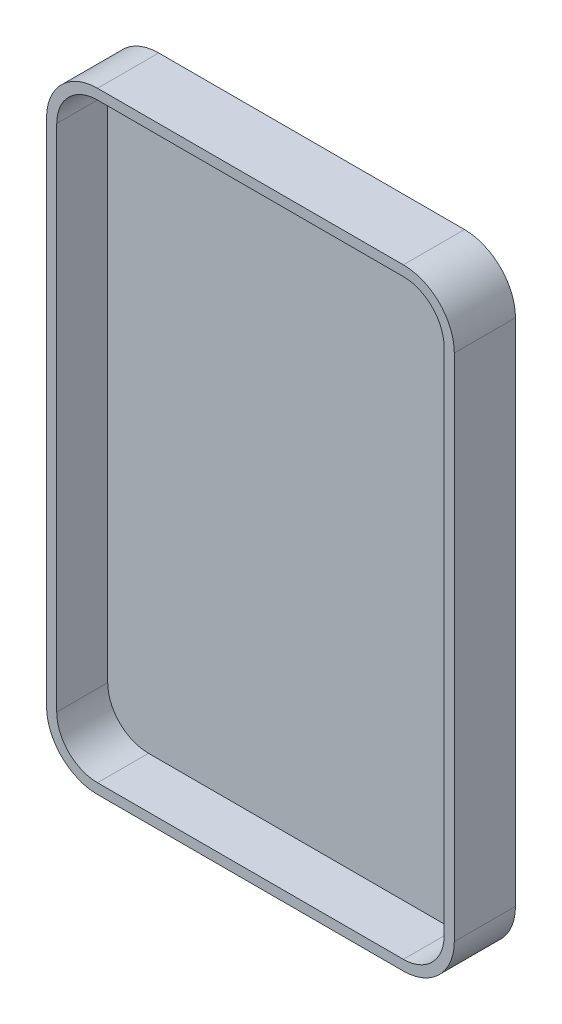
ISO-10303-21;
HEADER;
FILE_DESCRIPTION(('STEP AP214'),'2;1');
FILE_NAME('part.step','',(''),(''),'','','');
FILE_SCHEMA(('AUTOMOTIVE_DESIGN { 1 0 10303 214 1 1 1 1 }'));
ENDSEC;
DATA;
#1=APPLICATION_CONTEXT('core data for automotive mechanical design processes');
#2=APPLICATION_PROTOCOL_DEFINITION('international standard','automotive_design',2000,#1);
#3=PRODUCT_CONTEXT('',#1,'mechanical');
#4=PRODUCT('Part','Part','',(#3));
#5=PRODUCT_RELATED_PRODUCT_CATEGORY('part','',(#4));
#6=PRODUCT_DEFINITION_FORMATION('','',#4);
#7=PRODUCT_DEFINITION_CONTEXT('part definition',#1,'design');
#8=PRODUCT_DEFINITION('design','',#6,#7);
#9=PRODUCT_DEFINITION_SHAPE('','',#8);
#10=(LENGTH_UNIT() NAMED_UNIT(*) SI_UNIT(.MILLI.,.METRE.));
#11=(NAMED_UNIT(*) PLANE_ANGLE_UNIT() SI_UNIT($,.RADIAN.));
#12=(NAMED_UNIT(*) SI_UNIT($,.STERADIAN.) SOLID_ANGLE_UNIT());
#13=UNCERTAINTY_MEASURE_WITH_UNIT(LENGTH_MEASURE(1.E-05),#10,'distance_accuracy_value','');
#14=(GEOMETRIC_REPRESENTATION_CONTEXT(3) GLOBAL_UNCERTAINTY_ASSIGNED_CONTEXT((#13)) GLOBAL_UNIT_ASSIGNED_CONTEXT((#10,
#11,#12)) REPRESENTATION_CONTEXT('',''));
#15=CARTESIAN_POINT('',(0.,0.,0.));
#16=DIRECTION('',(0.,0.,1.));
#17=DIRECTION('',(1.,0.,0.));
#18=AXIS2_PLACEMENT_3D('',#15,#16,#17);
#19=CARTESIAN_POINT('',(0.,0.,2.));
#20=DIRECTION('',(0.,-1.,0.));
#21=DIRECTION('',(1.,0.,0.));
#22=AXIS2_PLACEMENT_3D('',#19,#20,#21);
#23=PLANE('',#22);
#24=DIRECTION('',(-1.,0.,0.));
#25=VECTOR('',#24,1.);
#26=CARTESIAN_POINT('',(0.,0.,0.));
#27=LINE('',#26,#25);
#28=CARTESIAN_POINT('',(-10.,0.,0.));
#29=VERTEX_POINT('',#28);
#30=CARTESIAN_POINT('',(-70.,0.,0.));
#31=VERTEX_POINT('',#30);
#32=EDGE_CURVE('E247',#29,#31,#27,.T.);
#33=ORIENTED_EDGE('',*,*,#32,.F.);
#34=DIRECTION('',(0.,0.,-1.));
#35=VECTOR('',#34,1.);
#36=CARTESIAN_POINT('',(-10.,0.,2.));
#37=LINE('',#36,#35);
#38=CARTESIAN_POINT('',(-10.,0.,12.));
#39=VERTEX_POINT('',#38);
#40=EDGE_CURVE('E11',#39,#29,#37,.T.);
#41=ORIENTED_EDGE('',*,*,#40,.F.);
#42=DIRECTION('',(1.,0.,0.));
#43=VECTOR('',#42,1.);
#44=CARTESIAN_POINT('',(0.,0.,12.));
#45=LINE('',#44,#43);
#46=CARTESIAN_POINT('',(-70.,0.,12.));
#47=VERTEX_POINT('',#46);
#48=EDGE_CURVE('E187',#47,#39,#45,.T.);
#49=ORIENTED_EDGE('',*,*,#48,.F.);
#50=DIRECTION('',(0.,0.,-1.));
#51=VECTOR('',#50,1.);
#52=CARTESIAN_POINT('',(-70.,0.,2.));
#53=LINE('',#52,#51);
#54=EDGE_CURVE('E266',#47,#31,#53,.T.);
#55=ORIENTED_EDGE('',*,*,#54,.T.);
#56=EDGE_LOOP('',(#33,#41,#49,#55));
#57=FACE_BOUND('',#56,.T.);
#58=ADVANCED_FACE('F35',(#57),#23,.T.);
#59=CARTESIAN_POINT('',(-10.,10.,2.));
#60=DIRECTION('',(0.,0.,-1.));
#61=DIRECTION('',(-1.,0.,0.));
#62=AXIS2_PLACEMENT_3D('',#59,#60,#61);
#63=CYLINDRICAL_SURFACE('',#62,10.);
#64=CARTESIAN_POINT('',(-10.,10.,0.));
#65=DIRECTION('',(0.,0.,1.));
#66=DIRECTION('',(1.,0.,0.));
#67=AXIS2_PLACEMENT_3D('',#64,#65,#66);
#68=CIRCLE('',#67,10.);
#69=CARTESIAN_POINT('',(0.,10.,0.));
#70=VERTEX_POINT('',#69);
#71=EDGE_CURVE('E250',#29,#70,#68,.T.);
#72=ORIENTED_EDGE('',*,*,#71,.T.);
#73=DIRECTION('',(0.,0.,-1.));
#74=VECTOR('',#73,1.);
#75=CARTESIAN_POINT('',(0.,10.,2.));
#76=LINE('',#75,#74);
#77=CARTESIAN_POINT('',(0.,10.,12.));
#78=VERTEX_POINT('',#77);
#79=EDGE_CURVE('E42',#78,#70,#76,.T.);
#80=ORIENTED_EDGE('',*,*,#79,.F.);
#81=CARTESIAN_POINT('',(-10.,10.,12.));
#82=DIRECTION('',(0.,0.,1.));
#83=DIRECTION('',(1.,0.,0.));
#84=AXIS2_PLACEMENT_3D('',#81,#82,#83);
#85=CIRCLE('',#84,10.);
#86=EDGE_CURVE('E171',#39,#78,#85,.T.);
#87=ORIENTED_EDGE('',*,*,#86,.F.);
#88=ORIENTED_EDGE('',*,*,#40,.T.);
#89=EDGE_LOOP('',(#72,#80,#87,#88));
#90=FACE_BOUND('',#89,.T.);
#91=ADVANCED_FACE('F297',(#90),#63,.T.);
#92=CARTESIAN_POINT('',(0.,0.,2.));
#93=DIRECTION('',(-1.,0.,0.));
#94=DIRECTION('',(0.,0.,1.));
#95=AXIS2_PLACEMENT_3D('',#92,#93,#94);
#96=PLANE('',#95);
#97=DIRECTION('',(0.,1.,0.));
#98=VECTOR('',#97,1.);
#99=CARTESIAN_POINT('',(0.,0.,0.));
#100=LINE('',#99,#98);
#101=CARTESIAN_POINT('',(0.,110.,0.));
#102=VERTEX_POINT('',#101);
#103=EDGE_CURVE('E152',#70,#102,#100,.T.);
#104=ORIENTED_EDGE('',*,*,#103,.T.);
#105=DIRECTION('',(0.,0.,-1.));
#106=VECTOR('',#105,1.);
#107=CARTESIAN_POINT('',(0.,110.,2.));
#108=LINE('',#107,#106);
#109=CARTESIAN_POINT('',(0.,110.,12.));
#110=VERTEX_POINT('',#109);
#111=EDGE_CURVE('E145',#110,#102,#108,.T.);
#112=ORIENTED_EDGE('',*,*,#111,.F.);
#113=DIRECTION('',(0.,1.,0.));
#114=VECTOR('',#113,1.);
#115=CARTESIAN_POINT('',(0.,0.,12.));
#116=LINE('',#115,#114);
#117=EDGE_CURVE('E150',#78,#110,#116,.T.);
#118=ORIENTED_EDGE('',*,*,#117,.F.);
#119=ORIENTED_EDGE('',*,*,#79,.T.);
#120=EDGE_LOOP('',(#104,#112,#118,#119));
#121=FACE_BOUND('',#120,.T.);
#122=ADVANCED_FACE('F147',(#121),#96,.F.);
#123=CARTESIAN_POINT('',(-10.,110.,2.));
#124=DIRECTION('',(0.,0.,-1.));
#125=DIRECTION('',(-1.,0.,0.));
#126=AXIS2_PLACEMENT_3D('',#123,#124,#125);
#127=CYLINDRICAL_SURFACE('',#126,10.);
#128=CARTESIAN_POINT('',(-10.,110.,0.));
#129=DIRECTION('',(0.,0.,1.));
#130=DIRECTION('',(1.,0.,0.));
#131=AXIS2_PLACEMENT_3D('',#128,#129,#130);
#132=CIRCLE('',#131,10.);
#133=CARTESIAN_POINT('',(-10.,120.,0.));
#134=VERTEX_POINT('',#133);
#135=EDGE_CURVE('E253',#102,#134,#132,.T.);
#136=ORIENTED_EDGE('',*,*,#135,.T.);
#137=DIRECTION('',(0.,0.,-1.));
#138=VECTOR('',#137,1.);
#139=CARTESIAN_POINT('',(-10.,120.,2.));
#140=LINE('',#139,#138);
#141=CARTESIAN_POINT('',(-10.,120.,12.));
#142=VERTEX_POINT('',#141);
#143=EDGE_CURVE('E155',#142,#134,#140,.T.);
#144=ORIENTED_EDGE('',*,*,#143,.F.);
#145=CARTESIAN_POINT('',(-10.,110.,12.));
#146=DIRECTION('',(0.,0.,1.));
#147=DIRECTION('',(1.,0.,0.));
#148=AXIS2_PLACEMENT_3D('',#145,#146,#147);
#149=CIRCLE('',#148,10.);
#150=EDGE_CURVE('E158',#110,#142,#149,.T.);
#151=ORIENTED_EDGE('',*,*,#150,.F.);
#152=ORIENTED_EDGE('',*,*,#111,.T.);
#153=EDGE_LOOP('',(#136,#144,#151,#152));
#154=FACE_BOUND('',#153,.T.);
#155=ADVANCED_FACE('F159',(#154),#127,.T.);
#156=CARTESIAN_POINT('',(0.,120.,2.));
#157=DIRECTION('',(0.,-1.,0.));
#158=DIRECTION('',(1.,0.,0.));
#159=AXIS2_PLACEMENT_3D('',#156,#157,#158);
#160=PLANE('',#159);
#161=DIRECTION('',(-1.,0.,0.));
#162=VECTOR('',#161,1.);
#163=CARTESIAN_POINT('',(0.,120.,0.));
#164=LINE('',#163,#162);
#165=CARTESIAN_POINT('',(-70.,120.,0.));
#166=VERTEX_POINT('',#165);
#167=EDGE_CURVE('E255',#134,#166,#164,.T.);
#168=ORIENTED_EDGE('',*,*,#167,.T.);
#169=DIRECTION('',(0.,0.,-1.));
#170=VECTOR('',#169,1.);
#171=CARTESIAN_POINT('',(-70.,120.,2.));
#172=LINE('',#171,#170);
#173=CARTESIAN_POINT('',(-70.,120.,12.));
#174=VERTEX_POINT('',#173);
#175=EDGE_CURVE('E272',#174,#166,#172,.T.);
#176=ORIENTED_EDGE('',*,*,#175,.F.);
#177=DIRECTION('',(-1.,0.,0.));
#178=VECTOR('',#177,1.);
#179=CARTESIAN_POINT('',(0.,120.,12.));
#180=LINE('',#179,#178);
#181=EDGE_CURVE('E164',#142,#174,#180,.T.);
#182=ORIENTED_EDGE('',*,*,#181,.F.);
#183=ORIENTED_EDGE('',*,*,#143,.T.);
#184=EDGE_LOOP('',(#168,#176,#182,#183));
#185=FACE_BOUND('',#184,.T.);
#186=ADVANCED_FACE('F283',(#185),#160,.F.);
#187=CARTESIAN_POINT('',(-70.,110.,2.));
#188=DIRECTION('',(0.,0.,-1.));
#189=DIRECTION('',(-1.,0.,0.));
#190=AXIS2_PLACEMENT_3D('',#187,#188,#189);
#191=CYLINDRICAL_SURFACE('',#190,10.);
#192=CARTESIAN_POINT('',(-70.,110.,0.));
#193=DIRECTION('',(0.,0.,1.));
#194=DIRECTION('',(1.,0.,0.));
#195=AXIS2_PLACEMENT_3D('',#192,#193,#194);
#196=CIRCLE('',#195,10.);
#197=CARTESIAN_POINT('',(-80.,110.,0.));
#198=VERTEX_POINT('',#197);
#199=EDGE_CURVE('E257',#166,#198,#196,.T.);
#200=ORIENTED_EDGE('',*,*,#199,.T.);
#201=DIRECTION('',(0.,0.,-1.));
#202=VECTOR('',#201,1.);
#203=CARTESIAN_POINT('',(-80.,110.,2.));
#204=LINE('',#203,#202);
#205=CARTESIAN_POINT('',(-80.,110.,12.));
#206=VERTEX_POINT('',#205);
#207=EDGE_CURVE('E270',#206,#198,#204,.T.);
#208=ORIENTED_EDGE('',*,*,#207,.F.);
#209=CARTESIAN_POINT('',(-70.,110.,12.));
#210=DIRECTION('',(0.,0.,1.));
#211=DIRECTION('',(1.,0.,0.));
#212=AXIS2_PLACEMENT_3D('',#209,#210,#211);
#213=CIRCLE('',#212,10.);
#214=EDGE_CURVE('E178',#174,#206,#213,.T.);
#215=ORIENTED_EDGE('',*,*,#214,.F.);
#216=ORIENTED_EDGE('',*,*,#175,.T.);
#217=EDGE_LOOP('',(#200,#208,#215,#216));
#218=FACE_BOUND('',#217,.T.);
#219=ADVANCED_FACE('F287',(#218),#191,.T.);
#220=CARTESIAN_POINT('',(-80.,0.,2.));
#221=DIRECTION('',(-1.,0.,0.));
#222=DIRECTION('',(0.,0.,1.));
#223=AXIS2_PLACEMENT_3D('',#220,#221,#222);
#224=PLANE('',#223);
#225=DIRECTION('',(0.,1.,0.));
#226=VECTOR('',#225,1.);
#227=CARTESIAN_POINT('',(-80.,0.,0.));
#228=LINE('',#227,#226);
#229=CARTESIAN_POINT('',(-80.,9.99999999999999,0.));
#230=VERTEX_POINT('',#229);
#231=EDGE_CURVE('E260',#230,#198,#228,.T.);
#232=ORIENTED_EDGE('',*,*,#231,.F.);
#233=DIRECTION('',(0.,0.,-1.));
#234=VECTOR('',#233,1.);
#235=CARTESIAN_POINT('',(-80.,9.99999999999999,2.));
#236=LINE('',#235,#234);
#237=CARTESIAN_POINT('',(-80.,9.99999999999999,12.));
#238=VERTEX_POINT('',#237);
#239=EDGE_CURVE('E268',#238,#230,#236,.T.);
#240=ORIENTED_EDGE('',*,*,#239,.F.);
#241=DIRECTION('',(0.,-1.,0.));
#242=VECTOR('',#241,1.);
#243=CARTESIAN_POINT('',(-80.,0.,12.));
#244=LINE('',#243,#242);
#245=EDGE_CURVE('E181',#206,#238,#244,.T.);
#246=ORIENTED_EDGE('',*,*,#245,.F.);
#247=ORIENTED_EDGE('',*,*,#207,.T.);
#248=EDGE_LOOP('',(#232,#240,#246,#247));
#249=FACE_BOUND('',#248,.T.);
#250=ADVANCED_FACE('F290',(#249),#224,.T.);
#251=CARTESIAN_POINT('',(-70.,9.99999999999999,2.));
#252=DIRECTION('',(0.,0.,-1.));
#253=DIRECTION('',(-1.,0.,0.));
#254=AXIS2_PLACEMENT_3D('',#251,#252,#253);
#255=CYLINDRICAL_SURFACE('',#254,10.);
#256=CARTESIAN_POINT('',(-70.,9.99999999999999,0.));
#257=DIRECTION('',(0.,0.,1.));
#258=DIRECTION('',(1.,0.,0.));
#259=AXIS2_PLACEMENT_3D('',#256,#257,#258);
#260=CIRCLE('',#259,10.);
#261=EDGE_CURVE('E263',#230,#31,#260,.T.);
#262=ORIENTED_EDGE('',*,*,#261,.T.);
#263=ORIENTED_EDGE('',*,*,#54,.F.);
#264=CARTESIAN_POINT('',(-70.,9.99999999999999,12.));
#265=DIRECTION('',(0.,0.,1.));
#266=DIRECTION('',(1.,0.,0.));
#267=AXIS2_PLACEMENT_3D('',#264,#265,#266);
#268=CIRCLE('',#267,10.);
#269=EDGE_CURVE('E184',#238,#47,#268,.T.);
#270=ORIENTED_EDGE('',*,*,#269,.F.);
#271=ORIENTED_EDGE('',*,*,#239,.T.);
#272=EDGE_LOOP('',(#262,#263,#270,#271));
#273=FACE_BOUND('',#272,.T.);
#274=ADVANCED_FACE('F294',(#273),#255,.T.);
#275=CARTESIAN_POINT('',(0.,0.,0.));
#276=DIRECTION('',(0.,0.,1.));
#277=DIRECTION('',(1.,0.,0.));
#278=AXIS2_PLACEMENT_3D('',#275,#276,#277);
#279=PLANE('',#278);
#280=ORIENTED_EDGE('',*,*,#32,.T.);
#281=ORIENTED_EDGE('',*,*,#261,.F.);
#282=ORIENTED_EDGE('',*,*,#231,.T.);
#283=ORIENTED_EDGE('',*,*,#199,.F.);
#284=ORIENTED_EDGE('',*,*,#167,.F.);
#285=ORIENTED_EDGE('',*,*,#135,.F.);
#286=ORIENTED_EDGE('',*,*,#103,.F.);
#287=ORIENTED_EDGE('',*,*,#71,.F.);
#288=EDGE_LOOP('',(#280,#281,#282,#283,#284,#285,#286,#287));
#289=FACE_BOUND('',#288,.T.);
#290=ADVANCED_FACE('F278',(#289),#279,.F.);
#291=CARTESIAN_POINT('',(-78.,0.,12.));
#292=DIRECTION('',(-1.,0.,0.));
#293=DIRECTION('',(0.,0.,1.));
#294=AXIS2_PLACEMENT_3D('',#291,#292,#293);
#295=PLANE('',#294);
#296=DIRECTION('',(0.,1.,0.));
#297=VECTOR('',#296,1.);
#298=CARTESIAN_POINT('',(-78.,0.,2.));
#299=LINE('',#298,#297);
#300=CARTESIAN_POINT('',(-78.,9.99999999999999,2.));
#301=VERTEX_POINT('',#300);
#302=CARTESIAN_POINT('',(-78.,110.,2.));
#303=VERTEX_POINT('',#302);
#304=EDGE_CURVE('E213',#301,#303,#299,.T.);
#305=ORIENTED_EDGE('',*,*,#304,.T.);
#306=DIRECTION('',(0.,0.,-1.));
#307=VECTOR('',#306,1.);
#308=CARTESIAN_POINT('',(-78.,110.,12.));
#309=LINE('',#308,#307);
#310=CARTESIAN_POINT('',(-78.,110.,12.));
#311=VERTEX_POINT('',#310);
#312=EDGE_CURVE('E245',#311,#303,#309,.T.);
#313=ORIENTED_EDGE('',*,*,#312,.F.);
#314=DIRECTION('',(0.,1.,0.));
#315=VECTOR('',#314,1.);
#316=CARTESIAN_POINT('',(-78.,0.,12.));
#317=LINE('',#316,#315);
#318=CARTESIAN_POINT('',(-78.,9.99999999999999,12.));
#319=VERTEX_POINT('',#318);
#320=EDGE_CURVE('E190',#319,#311,#317,.T.);
#321=ORIENTED_EDGE('',*,*,#320,.F.);
#322=DIRECTION('',(0.,0.,-1.));
#323=VECTOR('',#322,1.);
#324=CARTESIAN_POINT('',(-78.,9.99999999999999,12.));
#325=LINE('',#324,#323);
#326=EDGE_CURVE('E212',#319,#301,#325,.T.);
#327=ORIENTED_EDGE('',*,*,#326,.T.);
#328=EDGE_LOOP('',(#305,#313,#321,#327));
#329=FACE_BOUND('',#328,.T.);
#330=ADVANCED_FACE('F317',(#329),#295,.F.);
#331=CARTESIAN_POINT('',(-70.,110.,12.));
#332=DIRECTION('',(0.,0.,-1.));
#333=DIRECTION('',(-1.,0.,0.));
#334=AXIS2_PLACEMENT_3D('',#331,#332,#333);
#335=CYLINDRICAL_SURFACE('',#334,7.99999999999998);
#336=CARTESIAN_POINT('',(-70.,110.,2.));
#337=DIRECTION('',(0.,0.,1.));
#338=DIRECTION('',(1.,0.,0.));
#339=AXIS2_PLACEMENT_3D('',#336,#337,#338);
#340=CIRCLE('',#339,7.99999999999998);
#341=CARTESIAN_POINT('',(-70.,118.,2.));
#342=VERTEX_POINT('',#341);
#343=EDGE_CURVE('E49',#342,#303,#340,.T.);
#344=ORIENTED_EDGE('',*,*,#343,.F.);
#345=DIRECTION('',(0.,0.,-1.));
#346=VECTOR('',#345,1.);
#347=CARTESIAN_POINT('',(-70.,118.,12.));
#348=LINE('',#347,#346);
#349=CARTESIAN_POINT('',(-70.,118.,12.));
#350=VERTEX_POINT('',#349);
#351=EDGE_CURVE('E243',#350,#342,#348,.T.);
#352=ORIENTED_EDGE('',*,*,#351,.F.);
#353=CARTESIAN_POINT('',(-70.,110.,12.));
#354=DIRECTION('',(0.,0.,1.));
#355=DIRECTION('',(1.,0.,0.));
#356=AXIS2_PLACEMENT_3D('',#353,#354,#355);
#357=CIRCLE('',#356,7.99999999999998);
#358=EDGE_CURVE('E192',#350,#311,#357,.T.);
#359=ORIENTED_EDGE('',*,*,#358,.T.);
#360=ORIENTED_EDGE('',*,*,#312,.T.);
#361=EDGE_LOOP('',(#344,#352,#359,#360));
#362=FACE_BOUND('',#361,.T.);
#363=ADVANCED_FACE('F323',(#362),#335,.F.);
#364=CARTESIAN_POINT('',(0.,118.,12.));
#365=DIRECTION('',(0.,-1.,0.));
#366=DIRECTION('',(1.,0.,0.));
#367=AXIS2_PLACEMENT_3D('',#364,#365,#366);
#368=PLANE('',#367);
#369=DIRECTION('',(-1.,0.,0.));
#370=VECTOR('',#369,1.);
#371=CARTESIAN_POINT('',(0.,118.,2.));
#372=LINE('',#371,#370);
#373=CARTESIAN_POINT('',(-10.,118.,2.));
#374=VERTEX_POINT('',#373);
#375=EDGE_CURVE('E54',#374,#342,#372,.T.);
#376=ORIENTED_EDGE('',*,*,#375,.F.);
#377=DIRECTION('',(0.,0.,-1.));
#378=VECTOR('',#377,1.);
#379=CARTESIAN_POINT('',(-10.,118.,12.));
#380=LINE('',#379,#378);
#381=CARTESIAN_POINT('',(-10.,118.,12.));
#382=VERTEX_POINT('',#381);
#383=EDGE_CURVE('E240',#382,#374,#380,.T.);
#384=ORIENTED_EDGE('',*,*,#383,.F.);
#385=DIRECTION('',(-1.,0.,0.));
#386=VECTOR('',#385,1.);
#387=CARTESIAN_POINT('',(0.,118.,12.));
#388=LINE('',#387,#386);
#389=EDGE_CURVE('E195',#382,#350,#388,.T.);
#390=ORIENTED_EDGE('',*,*,#389,.T.);
#391=ORIENTED_EDGE('',*,*,#351,.T.);
#392=EDGE_LOOP('',(#376,#384,#390,#391));
#393=FACE_BOUND('',#392,.T.);
#394=ADVANCED_FACE('F327',(#393),#368,.T.);
#395=CARTESIAN_POINT('',(-9.99999999999999,110.,12.));
#396=DIRECTION('',(0.,0.,-1.));
#397=DIRECTION('',(-1.,0.,0.));
#398=AXIS2_PLACEMENT_3D('',#395,#396,#397);
#399=CYLINDRICAL_SURFACE('',#398,7.99999999999999);
#400=CARTESIAN_POINT('',(-9.99999999999999,110.,2.));
#401=DIRECTION('',(0.,0.,1.));
#402=DIRECTION('',(1.,0.,0.));
#403=AXIS2_PLACEMENT_3D('',#400,#401,#402);
#404=CIRCLE('',#403,7.99999999999999);
#405=CARTESIAN_POINT('',(-2.,110.,2.));
#406=VERTEX_POINT('',#405);
#407=EDGE_CURVE('E218',#406,#374,#404,.T.);
#408=ORIENTED_EDGE('',*,*,#407,.F.);
#409=DIRECTION('',(0.,0.,-1.));
#410=VECTOR('',#409,1.);
#411=CARTESIAN_POINT('',(-2.,110.,12.));
#412=LINE('',#411,#410);
#413=CARTESIAN_POINT('',(-2.,110.,12.));
#414=VERTEX_POINT('',#413);
#415=EDGE_CURVE('E237',#414,#406,#412,.T.);
#416=ORIENTED_EDGE('',*,*,#415,.F.);
#417=CARTESIAN_POINT('',(-9.99999999999999,110.,12.));
#418=DIRECTION('',(0.,0.,1.));
#419=DIRECTION('',(1.,0.,0.));
#420=AXIS2_PLACEMENT_3D('',#417,#418,#419);
#421=CIRCLE('',#420,7.99999999999999);
#422=EDGE_CURVE('E198',#414,#382,#421,.T.);
#423=ORIENTED_EDGE('',*,*,#422,.T.);
#424=ORIENTED_EDGE('',*,*,#383,.T.);
#425=EDGE_LOOP('',(#408,#416,#423,#424));
#426=FACE_BOUND('',#425,.T.);
#427=ADVANCED_FACE('F331',(#426),#399,.F.);
#428=CARTESIAN_POINT('',(-2.,0.,12.));
#429=DIRECTION('',(-1.,0.,0.));
#430=DIRECTION('',(0.,-1.,0.));
#431=AXIS2_PLACEMENT_3D('',#428,#429,#430);
#432=PLANE('',#431);
#433=DIRECTION('',(0.,1.,0.));
#434=VECTOR('',#433,1.);
#435=CARTESIAN_POINT('',(-2.,0.,2.));
#436=LINE('',#435,#434);
#437=CARTESIAN_POINT('',(-2.,10.,2.));
#438=VERTEX_POINT('',#437);
#439=EDGE_CURVE('E220',#438,#406,#436,.T.);
#440=ORIENTED_EDGE('',*,*,#439,.F.);
#441=DIRECTION('',(0.,0.,-1.));
#442=VECTOR('',#441,1.);
#443=CARTESIAN_POINT('',(-2.,10.,12.));
#444=LINE('',#443,#442);
#445=CARTESIAN_POINT('',(-2.,10.,12.));
#446=VERTEX_POINT('',#445);
#447=EDGE_CURVE('E234',#446,#438,#444,.T.);
#448=ORIENTED_EDGE('',*,*,#447,.F.);
#449=DIRECTION('',(0.,1.,0.));
#450=VECTOR('',#449,1.);
#451=CARTESIAN_POINT('',(-2.,0.,12.));
#452=LINE('',#451,#450);
#453=EDGE_CURVE('E201',#446,#414,#452,.T.);
#454=ORIENTED_EDGE('',*,*,#453,.T.);
#455=ORIENTED_EDGE('',*,*,#415,.T.);
#456=EDGE_LOOP('',(#440,#448,#454,#455));
#457=FACE_BOUND('',#456,.T.);
#458=ADVANCED_FACE('F335',(#457),#432,.T.);
#459=CARTESIAN_POINT('',(-10.,10.,12.));
#460=DIRECTION('',(0.,0.,-1.));
#461=DIRECTION('',(-1.,0.,0.));
#462=AXIS2_PLACEMENT_3D('',#459,#460,#461);
#463=CYLINDRICAL_SURFACE('',#462,8.);
#464=CARTESIAN_POINT('',(-10.,10.,2.));
#465=DIRECTION('',(0.,0.,1.));
#466=DIRECTION('',(1.,0.,0.));
#467=AXIS2_PLACEMENT_3D('',#464,#465,#466);
#468=CIRCLE('',#467,8.);
#469=CARTESIAN_POINT('',(-10.,2.,2.));
#470=VERTEX_POINT('',#469);
#471=EDGE_CURVE('E222',#470,#438,#468,.T.);
#472=ORIENTED_EDGE('',*,*,#471,.F.);
#473=DIRECTION('',(0.,0.,-1.));
#474=VECTOR('',#473,1.);
#475=CARTESIAN_POINT('',(-10.,2.,12.));
#476=LINE('',#475,#474);
#477=CARTESIAN_POINT('',(-10.,2.,12.));
#478=VERTEX_POINT('',#477);
#479=EDGE_CURVE('E231',#478,#470,#476,.T.);
#480=ORIENTED_EDGE('',*,*,#479,.F.);
#481=CARTESIAN_POINT('',(-10.,10.,12.));
#482=DIRECTION('',(0.,0.,1.));
#483=DIRECTION('',(1.,0.,0.));
#484=AXIS2_PLACEMENT_3D('',#481,#482,#483);
#485=CIRCLE('',#484,8.);
#486=EDGE_CURVE('E204',#478,#446,#485,.T.);
#487=ORIENTED_EDGE('',*,*,#486,.T.);
#488=ORIENTED_EDGE('',*,*,#447,.T.);
#489=EDGE_LOOP('',(#472,#480,#487,#488));
#490=FACE_BOUND('',#489,.T.);
#491=ADVANCED_FACE('F339',(#490),#463,.F.);
#492=CARTESIAN_POINT('',(0.,2.,12.));
#493=DIRECTION('',(0.,-1.,0.));
#494=DIRECTION('',(1.,0.,0.));
#495=AXIS2_PLACEMENT_3D('',#492,#493,#494);
#496=PLANE('',#495);
#497=DIRECTION('',(-1.,0.,0.));
#498=VECTOR('',#497,1.);
#499=CARTESIAN_POINT('',(0.,2.,2.));
#500=LINE('',#499,#498);
#501=CARTESIAN_POINT('',(-70.,2.,2.));
#502=VERTEX_POINT('',#501);
#503=EDGE_CURVE('E174',#470,#502,#500,.T.);
#504=ORIENTED_EDGE('',*,*,#503,.T.);
#505=DIRECTION('',(0.,0.,-1.));
#506=VECTOR('',#505,1.);
#507=CARTESIAN_POINT('',(-70.,1.99999999999999,12.));
#508=LINE('',#507,#506);
#509=CARTESIAN_POINT('',(-70.,1.99999999999999,12.));
#510=VERTEX_POINT('',#509);
#511=EDGE_CURVE('E228',#510,#502,#508,.T.);
#512=ORIENTED_EDGE('',*,*,#511,.F.);
#513=DIRECTION('',(-1.,0.,0.));
#514=VECTOR('',#513,1.);
#515=CARTESIAN_POINT('',(0.,2.,12.));
#516=LINE('',#515,#514);
#517=EDGE_CURVE('E207',#478,#510,#516,.T.);
#518=ORIENTED_EDGE('',*,*,#517,.F.);
#519=ORIENTED_EDGE('',*,*,#479,.T.);
#520=EDGE_LOOP('',(#504,#512,#518,#519));
#521=FACE_BOUND('',#520,.T.);
#522=ADVANCED_FACE('F343',(#521),#496,.F.);
#523=CARTESIAN_POINT('',(-70.,9.99999999999999,12.));
#524=DIRECTION('',(0.,0.,-1.));
#525=DIRECTION('',(-1.,0.,0.));
#526=AXIS2_PLACEMENT_3D('',#523,#524,#525);
#527=CYLINDRICAL_SURFACE('',#526,7.99999999999999);
#528=CARTESIAN_POINT('',(-70.,9.99999999999999,2.));
#529=DIRECTION('',(0.,0.,1.));
#530=DIRECTION('',(1.,0.,0.));
#531=AXIS2_PLACEMENT_3D('',#528,#529,#530);
#532=CIRCLE('',#531,7.99999999999999);
#533=EDGE_CURVE('E172',#301,#502,#532,.T.);
#534=ORIENTED_EDGE('',*,*,#533,.F.);
#535=ORIENTED_EDGE('',*,*,#326,.F.);
#536=CARTESIAN_POINT('',(-70.,9.99999999999999,12.));
#537=DIRECTION('',(0.,0.,1.));
#538=DIRECTION('',(1.,0.,0.));
#539=AXIS2_PLACEMENT_3D('',#536,#537,#538);
#540=CIRCLE('',#539,7.99999999999999);
#541=EDGE_CURVE('E209',#319,#510,#540,.T.);
#542=ORIENTED_EDGE('',*,*,#541,.T.);
#543=ORIENTED_EDGE('',*,*,#511,.T.);
#544=EDGE_LOOP('',(#534,#535,#542,#543));
#545=FACE_BOUND('',#544,.T.);
#546=ADVANCED_FACE('F347',(#545),#527,.F.);
#547=CARTESIAN_POINT('',(0.,0.,12.));
#548=DIRECTION('',(0.,0.,1.));
#549=DIRECTION('',(1.,0.,0.));
#550=AXIS2_PLACEMENT_3D('',#547,#548,#549);
#551=PLANE('',#550);
#552=ORIENTED_EDGE('',*,*,#117,.T.);
#553=ORIENTED_EDGE('',*,*,#150,.T.);
#554=ORIENTED_EDGE('',*,*,#181,.T.);
#555=ORIENTED_EDGE('',*,*,#214,.T.);
#556=ORIENTED_EDGE('',*,*,#245,.T.);
#557=ORIENTED_EDGE('',*,*,#269,.T.);
#558=ORIENTED_EDGE('',*,*,#48,.T.);
#559=ORIENTED_EDGE('',*,*,#86,.T.);
#560=EDGE_LOOP('',(#552,#553,#554,#555,#556,#557,#558,#559));
#561=FACE_BOUND('',#560,.T.);
#562=ORIENTED_EDGE('',*,*,#320,.T.);
#563=ORIENTED_EDGE('',*,*,#358,.F.);
#564=ORIENTED_EDGE('',*,*,#389,.F.);
#565=ORIENTED_EDGE('',*,*,#422,.F.);
#566=ORIENTED_EDGE('',*,*,#453,.F.);
#567=ORIENTED_EDGE('',*,*,#486,.F.);
#568=ORIENTED_EDGE('',*,*,#517,.T.);
#569=ORIENTED_EDGE('',*,*,#541,.F.);
#570=EDGE_LOOP('',(#562,#563,#564,#565,#566,#567,#568,#569));
#571=FACE_BOUND('',#570,.T.);
#572=ADVANCED_FACE('F167',(#561,#571),#551,.T.);
#573=CARTESIAN_POINT('',(0.,0.,2.));
#574=DIRECTION('',(0.,0.,1.));
#575=DIRECTION('',(1.,0.,0.));
#576=AXIS2_PLACEMENT_3D('',#573,#574,#575);
#577=PLANE('',#576);
#578=ORIENTED_EDGE('',*,*,#343,.T.);
#579=ORIENTED_EDGE('',*,*,#304,.F.);
#580=ORIENTED_EDGE('',*,*,#533,.T.);
#581=ORIENTED_EDGE('',*,*,#503,.F.);
#582=ORIENTED_EDGE('',*,*,#471,.T.);
#583=ORIENTED_EDGE('',*,*,#439,.T.);
#584=ORIENTED_EDGE('',*,*,#407,.T.);
#585=ORIENTED_EDGE('',*,*,#375,.T.);
#586=EDGE_LOOP('',(#578,#579,#580,#581,#582,#583,#584,#585));
#587=FACE_BOUND('',#586,.T.);
#588=ADVANCED_FACE('F318',(#587),#577,.T.);
#589=CLOSED_SHELL('',(#58,#91,#122,#155,#186,#219,#250,#274,#290,#330,#363,#394,#427,#458,#491,
#522,#546,#572,#588));
#590=MANIFOLD_SOLID_BREP('B2',#589);
#591=ADVANCED_BREP_SHAPE_REPRESENTATION('',(#18,#590),#14);
#592=SHAPE_DEFINITION_REPRESENTATION(#9,#591);
ENDSEC;
END-ISO-10303-21;
